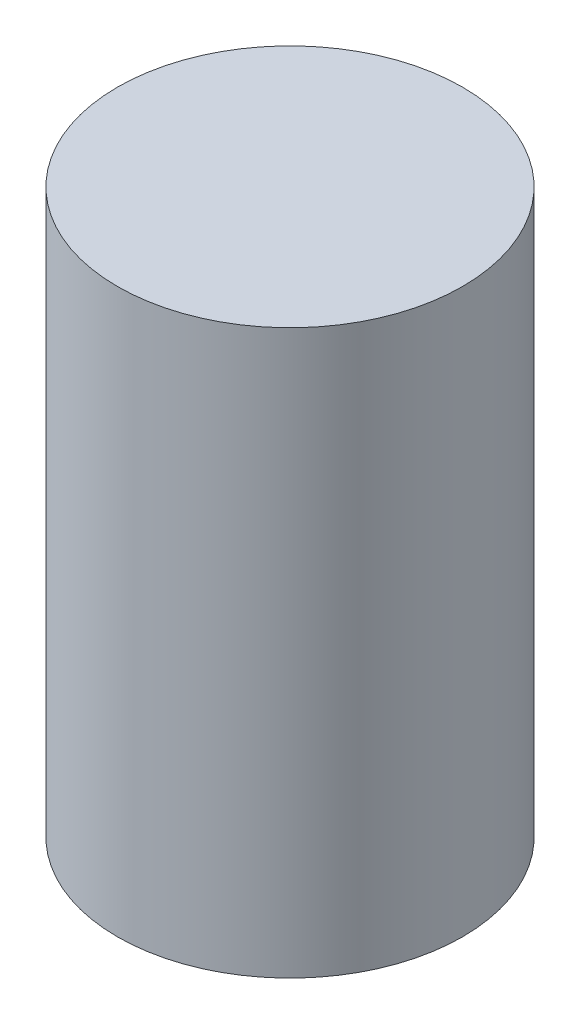
ISO-10303-21;
HEADER;
FILE_DESCRIPTION(('STEP AP214'),'2;1');
FILE_NAME('part.step','',(''),(''),'','','');
FILE_SCHEMA(('AUTOMOTIVE_DESIGN { 1 0 10303 214 1 1 1 1 }'));
ENDSEC;
DATA;
#1=APPLICATION_CONTEXT('core data for automotive mechanical design processes');
#2=APPLICATION_PROTOCOL_DEFINITION('international standard','automotive_design',2000,#1);
#3=PRODUCT_CONTEXT('',#1,'mechanical');
#4=PRODUCT('Part','Part','',(#3));
#5=PRODUCT_RELATED_PRODUCT_CATEGORY('part','',(#4));
#6=PRODUCT_DEFINITION_FORMATION('','',#4);
#7=PRODUCT_DEFINITION_CONTEXT('part definition',#1,'design');
#8=PRODUCT_DEFINITION('design','',#6,#7);
#9=PRODUCT_DEFINITION_SHAPE('','',#8);
#10=(LENGTH_UNIT() NAMED_UNIT(*) SI_UNIT(.MILLI.,.METRE.));
#11=(NAMED_UNIT(*) PLANE_ANGLE_UNIT() SI_UNIT($,.RADIAN.));
#12=(NAMED_UNIT(*) SI_UNIT($,.STERADIAN.) SOLID_ANGLE_UNIT());
#13=UNCERTAINTY_MEASURE_WITH_UNIT(LENGTH_MEASURE(1.E-05),#10,'distance_accuracy_value','');
#14=(GEOMETRIC_REPRESENTATION_CONTEXT(3) GLOBAL_UNCERTAINTY_ASSIGNED_CONTEXT((#13)) GLOBAL_UNIT_ASSIGNED_CONTEXT((#10,
#11,#12)) REPRESENTATION_CONTEXT('',''));
#15=CARTESIAN_POINT('',(0.,0.,0.));
#16=DIRECTION('',(0.,0.,1.));
#17=DIRECTION('',(1.,0.,0.));
#18=AXIS2_PLACEMENT_3D('',#15,#16,#17);
#19=CARTESIAN_POINT('',(0.,155.,0.));
#20=DIRECTION('',(0.,-1.,0.));
#21=DIRECTION('',(0.,0.,-1.));
#22=AXIS2_PLACEMENT_3D('',#19,#20,#21);
#23=CYLINDRICAL_SURFACE('',#22,47.5);
#24=CARTESIAN_POINT('',(0.,155.,0.));
#25=DIRECTION('',(0.,1.,0.));
#26=DIRECTION('',(0.,0.,1.));
#27=AXIS2_PLACEMENT_3D('',#24,#25,#26);
#28=CIRCLE('',#27,47.5);
#29=CARTESIAN_POINT('',(0.,155.,47.5));
#30=VERTEX_POINT('',#29);
#31=EDGE_CURVE('E10',#30,#30,#28,.T.);
#32=ORIENTED_EDGE('',*,*,#31,.F.);
#33=EDGE_LOOP('',(#32));
#34=FACE_BOUND('',#33,.T.);
#35=CARTESIAN_POINT('',(0.,0.,0.));
#36=DIRECTION('',(0.,1.,0.));
#37=DIRECTION('',(0.,0.,1.));
#38=AXIS2_PLACEMENT_3D('',#35,#36,#37);
#39=CIRCLE('',#38,47.5);
#40=CARTESIAN_POINT('',(0.,0.,47.5));
#41=VERTEX_POINT('',#40);
#42=EDGE_CURVE('E40',#41,#41,#39,.T.);
#43=ORIENTED_EDGE('',*,*,#42,.T.);
#44=EDGE_LOOP('',(#43));
#45=FACE_BOUND('',#44,.T.);
#46=ADVANCED_FACE('F37',(#34,#45),#23,.T.);
#47=CARTESIAN_POINT('',(0.,155.,0.));
#48=DIRECTION('',(0.,1.,0.));
#49=DIRECTION('',(0.,0.,1.));
#50=AXIS2_PLACEMENT_3D('',#47,#48,#49);
#51=PLANE('',#50);
#52=ORIENTED_EDGE('',*,*,#31,.T.);
#53=EDGE_LOOP('',(#52));
#54=FACE_BOUND('',#53,.T.);
#55=ADVANCED_FACE('F54',(#54),#51,.T.);
#56=CARTESIAN_POINT('',(0.,0.,0.));
#57=DIRECTION('',(0.,1.,0.));
#58=DIRECTION('',(0.,0.,1.));
#59=AXIS2_PLACEMENT_3D('',#56,#57,#58);
#60=PLANE('',#59);
#61=ORIENTED_EDGE('',*,*,#42,.F.);
#62=EDGE_LOOP('',(#61));
#63=FACE_BOUND('',#62,.T.);
#64=ADVANCED_FACE('F52',(#63),#60,.F.);
#65=CLOSED_SHELL('',(#46,#55,#64));
#66=MANIFOLD_SOLID_BREP('B2',#65);
#67=ADVANCED_BREP_SHAPE_REPRESENTATION('',(#18,#66),#14);
#68=SHAPE_DEFINITION_REPRESENTATION(#9,#67);
ENDSEC;
END-ISO-10303-21;
